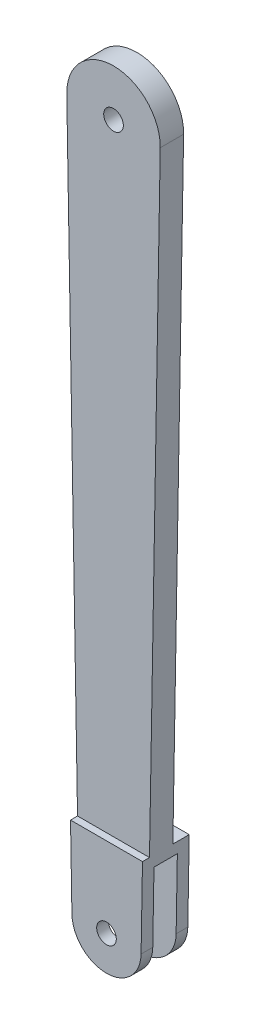
ISO-10303-21;
HEADER;
FILE_DESCRIPTION(('STEP AP214'),'2;1');
FILE_NAME('part.step','',(''),(''),'','','');
FILE_SCHEMA(('AUTOMOTIVE_DESIGN { 1 0 10303 214 1 1 1 1 }'));
ENDSEC;
DATA;
#1=APPLICATION_CONTEXT('core data for automotive mechanical design processes');
#2=APPLICATION_PROTOCOL_DEFINITION('international standard','automotive_design',2000,#1);
#3=PRODUCT_CONTEXT('',#1,'mechanical');
#4=PRODUCT('Part','Part','',(#3));
#5=PRODUCT_RELATED_PRODUCT_CATEGORY('part','',(#4));
#6=PRODUCT_DEFINITION_FORMATION('','',#4);
#7=PRODUCT_DEFINITION_CONTEXT('part definition',#1,'design');
#8=PRODUCT_DEFINITION('design','',#6,#7);
#9=PRODUCT_DEFINITION_SHAPE('','',#8);
#10=(LENGTH_UNIT() NAMED_UNIT(*) SI_UNIT(.MILLI.,.METRE.));
#11=(NAMED_UNIT(*) PLANE_ANGLE_UNIT() SI_UNIT($,.RADIAN.));
#12=(NAMED_UNIT(*) SI_UNIT($,.STERADIAN.) SOLID_ANGLE_UNIT());
#13=UNCERTAINTY_MEASURE_WITH_UNIT(LENGTH_MEASURE(1.E-05),#10,'distance_accuracy_value','');
#14=(GEOMETRIC_REPRESENTATION_CONTEXT(3) GLOBAL_UNCERTAINTY_ASSIGNED_CONTEXT((#13)) GLOBAL_UNIT_ASSIGNED_CONTEXT((#10,
#11,#12)) REPRESENTATION_CONTEXT('',''));
#15=CARTESIAN_POINT('',(0.,0.,0.));
#16=DIRECTION('',(0.,0.,1.));
#17=DIRECTION('',(1.,0.,0.));
#18=AXIS2_PLACEMENT_3D('',#15,#16,#17);
#19=CARTESIAN_POINT('',(8.6986929684867,-0.150799999999997,2.5));
#20=DIRECTION('',(0.999849766492724,-0.017333333333333,0.));
#21=DIRECTION('',(0.017333333333333,0.999849766492725,0.));
#22=AXIS2_PLACEMENT_3D('',#19,#20,#21);
#23=PLANE('',#22);
#24=DIRECTION('',(0.,0.,1.));
#25=VECTOR('',#24,1.);
#26=CARTESIAN_POINT('',(7.39888827204619,-75.1282666666667,-10.));
#27=LINE('',#26,#25);
#28=CARTESIAN_POINT('',(7.39888827204619,-75.1282666666667,-6.));
#29=VERTEX_POINT('',#28);
#30=CARTESIAN_POINT('',(7.39888827204618,-75.1282666666667,-3.5));
#31=VERTEX_POINT('',#30);
#32=EDGE_CURVE('E149',#29,#31,#27,.T.);
#33=ORIENTED_EDGE('',*,*,#32,.F.);
#34=DIRECTION('',(-0.017333333333333,-0.999849766492725,0.));
#35=VECTOR('',#34,1.);
#36=CARTESIAN_POINT('',(8.6986929684867,-0.150799999999997,-6.));
#37=LINE('',#36,#35);
#38=CARTESIAN_POINT('',(7.69841209667576,-57.8506420831153,-6.));
#39=VERTEX_POINT('',#38);
#40=EDGE_CURVE('E58',#39,#29,#37,.T.);
#41=ORIENTED_EDGE('',*,*,#40,.F.);
#42=DIRECTION('',(0.,0.,1.));
#43=VECTOR('',#42,1.);
#44=CARTESIAN_POINT('',(7.69841209667576,-57.8506420831153,-10.));
#45=LINE('',#44,#43);
#46=CARTESIAN_POINT('',(7.69841209667576,-57.8506420831153,-2.5));
#47=VERTEX_POINT('',#46);
#48=EDGE_CURVE('E211',#39,#47,#45,.T.);
#49=ORIENTED_EDGE('',*,*,#48,.T.);
#50=DIRECTION('',(-0.017333333333333,-0.999849766492725,0.));
#51=VECTOR('',#50,1.);
#52=CARTESIAN_POINT('',(8.6986929684867,-0.150799999999997,-2.5));
#53=LINE('',#52,#51);
#54=CARTESIAN_POINT('',(9.99849766492722,74.8266666666667,-2.5));
#55=VERTEX_POINT('',#54);
#56=EDGE_CURVE('E170',#55,#47,#53,.T.);
#57=ORIENTED_EDGE('',*,*,#56,.F.);
#58=DIRECTION('',(0.,0.,-1.));
#59=VECTOR('',#58,1.);
#60=CARTESIAN_POINT('',(9.99849766492722,74.8266666666667,2.5));
#61=LINE('',#60,#59);
#62=CARTESIAN_POINT('',(9.99849766492722,74.8266666666667,2.5));
#63=VERTEX_POINT('',#62);
#64=EDGE_CURVE('E178',#63,#55,#61,.T.);
#65=ORIENTED_EDGE('',*,*,#64,.F.);
#66=DIRECTION('',(-0.017333333333333,-0.999849766492725,0.));
#67=VECTOR('',#66,1.);
#68=CARTESIAN_POINT('',(8.6986929684867,-0.150799999999997,2.5));
#69=LINE('',#68,#67);
#70=CARTESIAN_POINT('',(7.69841209667576,-57.8506420831153,2.5));
#71=VERTEX_POINT('',#70);
#72=EDGE_CURVE('E157',#63,#71,#69,.T.);
#73=ORIENTED_EDGE('',*,*,#72,.T.);
#74=CARTESIAN_POINT('',(7.69841209667576,-57.8506420831153,4.));
#75=VERTEX_POINT('',#74);
#76=EDGE_CURVE('E212',#71,#75,#45,.T.);
#77=ORIENTED_EDGE('',*,*,#76,.T.);
#78=DIRECTION('',(-0.017333333333333,-0.999849766492725,0.));
#79=VECTOR('',#78,1.);
#80=CARTESIAN_POINT('',(8.6986929684867,-0.150799999999997,4.));
#81=LINE('',#80,#79);
#82=CARTESIAN_POINT('',(7.39888827204619,-75.1282666666667,4.));
#83=VERTEX_POINT('',#82);
#84=EDGE_CURVE('E205',#75,#83,#81,.T.);
#85=ORIENTED_EDGE('',*,*,#84,.T.);
#86=CARTESIAN_POINT('',(7.39888827204618,-75.1282666666667,1.50000000000001));
#87=VERTEX_POINT('',#86);
#88=EDGE_CURVE('E146',#87,#83,#27,.T.);
#89=ORIENTED_EDGE('',*,*,#88,.F.);
#90=DIRECTION('',(-0.017333333333333,-0.999849766492725,0.));
#91=VECTOR('',#90,1.);
#92=CARTESIAN_POINT('',(8.6986929684867,-0.150799999999997,1.49999999999997));
#93=LINE('',#92,#91);
#94=CARTESIAN_POINT('',(7.6585339990367,-60.1509559261494,1.5));
#95=VERTEX_POINT('',#94);
#96=EDGE_CURVE('E190',#95,#87,#93,.T.);
#97=ORIENTED_EDGE('',*,*,#96,.F.);
#98=DIRECTION('',(0.,0.,1.));
#99=VECTOR('',#98,1.);
#100=CARTESIAN_POINT('',(7.6585339990367,-60.1509559261494,2.5));
#101=LINE('',#100,#99);
#102=CARTESIAN_POINT('',(7.6585339990367,-60.1509559261494,-3.5));
#103=VERTEX_POINT('',#102);
#104=EDGE_CURVE('E189',#103,#95,#101,.T.);
#105=ORIENTED_EDGE('',*,*,#104,.F.);
#106=DIRECTION('',(0.017333333333333,0.999849766492725,0.));
#107=VECTOR('',#106,1.);
#108=CARTESIAN_POINT('',(8.6986929684867,-0.150799999999998,-3.50000000000001));
#109=LINE('',#108,#107);
#110=EDGE_CURVE('E183',#31,#103,#109,.T.);
#111=ORIENTED_EDGE('',*,*,#110,.F.);
#112=EDGE_LOOP('',(#33,#41,#49,#57,#65,#73,#77,#85,#89,#97,#105,#111));
#113=FACE_BOUND('',#112,.T.);
#114=ADVANCED_FACE('F43',(#113),#23,.T.);
#115=CARTESIAN_POINT('',(-8.69869296848671,-0.150800000000002,2.5));
#116=DIRECTION('',(0.999849766492724,0.0173333333333336,0.));
#117=DIRECTION('',(-0.0173333333333336,0.999849766492725,0.));
#118=AXIS2_PLACEMENT_3D('',#115,#116,#117);
#119=PLANE('',#118);
#120=DIRECTION('',(-0.0173333333333336,0.999849766492725,0.));
#121=VECTOR('',#120,1.);
#122=CARTESIAN_POINT('',(-8.69869296848671,-0.150800000000002,-6.));
#123=LINE('',#122,#121);
#124=CARTESIAN_POINT('',(-7.39888827204615,-75.1282666666667,-6.));
#125=VERTEX_POINT('',#124);
#126=CARTESIAN_POINT('',(-7.69841209667573,-57.8506420831153,-6.));
#127=VERTEX_POINT('',#126);
#128=EDGE_CURVE('E132',#125,#127,#123,.T.);
#129=ORIENTED_EDGE('',*,*,#128,.F.);
#130=DIRECTION('',(0.,0.,1.));
#131=VECTOR('',#130,1.);
#132=CARTESIAN_POINT('',(-7.39888827204615,-75.1282666666667,-10.));
#133=LINE('',#132,#131);
#134=CARTESIAN_POINT('',(-7.39888827204615,-75.1282666666667,-3.5));
#135=VERTEX_POINT('',#134);
#136=EDGE_CURVE('E66',#125,#135,#133,.T.);
#137=ORIENTED_EDGE('',*,*,#136,.T.);
#138=DIRECTION('',(0.0173333333333336,-0.999849766492725,0.));
#139=VECTOR('',#138,1.);
#140=CARTESIAN_POINT('',(-7.65393207105147,-60.4164118850773,-3.5));
#141=LINE('',#140,#139);
#142=CARTESIAN_POINT('',(-7.65393207105147,-60.4164118850773,-3.5));
#143=VERTEX_POINT('',#142);
#144=EDGE_CURVE('E185',#143,#135,#141,.T.);
#145=ORIENTED_EDGE('',*,*,#144,.F.);
#146=DIRECTION('',(0.,0.,-1.));
#147=VECTOR('',#146,1.);
#148=CARTESIAN_POINT('',(-7.65393207105147,-60.4164118850773,1.5));
#149=LINE('',#148,#147);
#150=CARTESIAN_POINT('',(-7.65393207105147,-60.4164118850773,1.5));
#151=VERTEX_POINT('',#150);
#152=EDGE_CURVE('E240',#151,#143,#149,.T.);
#153=ORIENTED_EDGE('',*,*,#152,.F.);
#154=DIRECTION('',(-0.0173333333333336,0.999849766492725,0.));
#155=VECTOR('',#154,1.);
#156=CARTESIAN_POINT('',(-7.65393207105147,-60.4164118850773,1.5));
#157=LINE('',#156,#155);
#158=CARTESIAN_POINT('',(-7.39888827204615,-75.1282666666667,1.50000000000001));
#159=VERTEX_POINT('',#158);
#160=EDGE_CURVE('E231',#159,#151,#157,.T.);
#161=ORIENTED_EDGE('',*,*,#160,.F.);
#162=CARTESIAN_POINT('',(-7.39888827204615,-75.1282666666667,4.));
#163=VERTEX_POINT('',#162);
#164=EDGE_CURVE('E147',#159,#163,#133,.T.);
#165=ORIENTED_EDGE('',*,*,#164,.T.);
#166=DIRECTION('',(0.0173333333333336,-0.999849766492725,0.));
#167=VECTOR('',#166,1.);
#168=CARTESIAN_POINT('',(-8.69869296848671,-0.150800000000002,4.));
#169=LINE('',#168,#167);
#170=CARTESIAN_POINT('',(-7.69841209667573,-57.8506420831153,4.));
#171=VERTEX_POINT('',#170);
#172=EDGE_CURVE('E199',#171,#163,#169,.T.);
#173=ORIENTED_EDGE('',*,*,#172,.F.);
#174=DIRECTION('',(0.,0.,1.));
#175=VECTOR('',#174,1.);
#176=CARTESIAN_POINT('',(-7.69841209667573,-57.8506420831153,-10.));
#177=LINE('',#176,#175);
#178=CARTESIAN_POINT('',(-7.69841209667573,-57.8506420831153,2.5));
#179=VERTEX_POINT('',#178);
#180=EDGE_CURVE('E210',#179,#171,#177,.T.);
#181=ORIENTED_EDGE('',*,*,#180,.F.);
#182=DIRECTION('',(0.0173333333333336,-0.999849766492725,0.));
#183=VECTOR('',#182,1.);
#184=CARTESIAN_POINT('',(-8.69869296848671,-0.150800000000002,2.5));
#185=LINE('',#184,#183);
#186=CARTESIAN_POINT('',(-9.99849766492727,74.8266666666667,2.5));
#187=VERTEX_POINT('',#186);
#188=EDGE_CURVE('E163',#187,#179,#185,.T.);
#189=ORIENTED_EDGE('',*,*,#188,.F.);
#190=DIRECTION('',(0.,0.,-1.));
#191=VECTOR('',#190,1.);
#192=CARTESIAN_POINT('',(-9.99849766492727,74.8266666666667,2.5));
#193=LINE('',#192,#191);
#194=CARTESIAN_POINT('',(-9.99849766492727,74.8266666666667,-2.5));
#195=VERTEX_POINT('',#194);
#196=EDGE_CURVE('E166',#187,#195,#193,.T.);
#197=ORIENTED_EDGE('',*,*,#196,.T.);
#198=DIRECTION('',(0.0173333333333336,-0.999849766492725,0.));
#199=VECTOR('',#198,1.);
#200=CARTESIAN_POINT('',(-8.69869296848671,-0.150800000000002,-2.5));
#201=LINE('',#200,#199);
#202=CARTESIAN_POINT('',(-7.69841209667573,-57.8506420831153,-2.5));
#203=VERTEX_POINT('',#202);
#204=EDGE_CURVE('E158',#195,#203,#201,.T.);
#205=ORIENTED_EDGE('',*,*,#204,.T.);
#206=EDGE_CURVE('E140',#127,#203,#177,.T.);
#207=ORIENTED_EDGE('',*,*,#206,.F.);
#208=EDGE_LOOP('',(#129,#137,#145,#153,#161,#165,#173,#181,#189,#197,#205,#207));
#209=FACE_BOUND('',#208,.T.);
#210=ADVANCED_FACE('F138',(#209),#119,.F.);
#211=CARTESIAN_POINT('',(0.,-57.8506420831153,-10.));
#212=DIRECTION('',(0.,-1.,0.));
#213=DIRECTION('',(1.,0.,0.));
#214=AXIS2_PLACEMENT_3D('',#211,#212,#213);
#215=PLANE('',#214);
#216=DIRECTION('',(1.,0.,0.));
#217=VECTOR('',#216,1.);
#218=CARTESIAN_POINT('',(0.,-57.8506420831153,-6.));
#219=LINE('',#218,#217);
#220=EDGE_CURVE('E141',#127,#39,#219,.T.);
#221=ORIENTED_EDGE('',*,*,#220,.F.);
#222=ORIENTED_EDGE('',*,*,#206,.T.);
#223=DIRECTION('',(1.,0.,0.));
#224=VECTOR('',#223,1.);
#225=CARTESIAN_POINT('',(0.,-57.8506420831153,-2.5));
#226=LINE('',#225,#224);
#227=EDGE_CURVE('E167',#203,#47,#226,.T.);
#228=ORIENTED_EDGE('',*,*,#227,.T.);
#229=ORIENTED_EDGE('',*,*,#48,.F.);
#230=EDGE_LOOP('',(#221,#222,#228,#229));
#231=FACE_BOUND('',#230,.T.);
#232=ADVANCED_FACE('F277',(#231),#215,.F.);
#233=CARTESIAN_POINT('',(0.,-75.,-10.));
#234=DIRECTION('',(0.,0.,1.));
#235=DIRECTION('',(1.,0.,0.));
#236=AXIS2_PLACEMENT_3D('',#233,#234,#235);
#237=CYLINDRICAL_SURFACE('',#236,7.4);
#238=ORIENTED_EDGE('',*,*,#136,.F.);
#239=CARTESIAN_POINT('',(0.,-75.,-6.));
#240=DIRECTION('',(0.,0.,-1.));
#241=DIRECTION('',(-1.,0.,0.));
#242=AXIS2_PLACEMENT_3D('',#239,#240,#241);
#243=CIRCLE('',#242,7.4);
#244=EDGE_CURVE('E130',#29,#125,#243,.T.);
#245=ORIENTED_EDGE('',*,*,#244,.F.);
#246=ORIENTED_EDGE('',*,*,#32,.T.);
#247=CARTESIAN_POINT('',(0.,-75.,-3.5));
#248=DIRECTION('',(0.,0.,-1.));
#249=DIRECTION('',(0.,1.,0.));
#250=AXIS2_PLACEMENT_3D('',#247,#248,#249);
#251=CIRCLE('',#250,7.4);
#252=EDGE_CURVE('E51',#135,#31,#251,.F.);
#253=ORIENTED_EDGE('',*,*,#252,.F.);
#254=EDGE_LOOP('',(#238,#245,#246,#253));
#255=FACE_BOUND('',#254,.T.);
#256=ADVANCED_FACE('F144',(#255),#237,.T.);
#257=CARTESIAN_POINT('',(0.,-75.,1.50000000000001));
#258=DIRECTION('',(0.,0.,1.));
#259=DIRECTION('',(0.,-1.,0.));
#260=AXIS2_PLACEMENT_3D('',#257,#258,#259);
#261=CIRCLE('',#260,7.4);
#262=EDGE_CURVE('E11',#87,#159,#261,.F.);
#263=ORIENTED_EDGE('',*,*,#262,.F.);
#264=ORIENTED_EDGE('',*,*,#88,.T.);
#265=CARTESIAN_POINT('',(0.,-75.,4.));
#266=DIRECTION('',(0.,0.,1.));
#267=DIRECTION('',(1.,0.,0.));
#268=AXIS2_PLACEMENT_3D('',#265,#266,#267);
#269=CIRCLE('',#268,7.4);
#270=EDGE_CURVE('E202',#163,#83,#269,.T.);
#271=ORIENTED_EDGE('',*,*,#270,.F.);
#272=ORIENTED_EDGE('',*,*,#164,.F.);
#273=EDGE_LOOP('',(#263,#264,#271,#272));
#274=FACE_BOUND('',#273,.T.);
#275=ADVANCED_FACE('F234',(#274),#237,.T.);
#276=CARTESIAN_POINT('',(0.,75.,2.5));
#277=DIRECTION('',(0.,0.,-1.));
#278=DIRECTION('',(-1.,0.,0.));
#279=AXIS2_PLACEMENT_3D('',#276,#277,#278);
#280=CYLINDRICAL_SURFACE('',#279,10.);
#281=CARTESIAN_POINT('',(0.,75.,-2.5));
#282=DIRECTION('',(0.,0.,1.));
#283=DIRECTION('',(1.,0.,0.));
#284=AXIS2_PLACEMENT_3D('',#281,#282,#283);
#285=CIRCLE('',#284,10.);
#286=EDGE_CURVE('E173',#55,#195,#285,.T.);
#287=ORIENTED_EDGE('',*,*,#286,.T.);
#288=ORIENTED_EDGE('',*,*,#196,.F.);
#289=CARTESIAN_POINT('',(0.,75.,2.5));
#290=DIRECTION('',(0.,0.,1.));
#291=DIRECTION('',(1.,0.,0.));
#292=AXIS2_PLACEMENT_3D('',#289,#290,#291);
#293=CIRCLE('',#292,10.);
#294=EDGE_CURVE('E161',#63,#187,#293,.T.);
#295=ORIENTED_EDGE('',*,*,#294,.F.);
#296=ORIENTED_EDGE('',*,*,#64,.T.);
#297=EDGE_LOOP('',(#287,#288,#295,#296));
#298=FACE_BOUND('',#297,.T.);
#299=ADVANCED_FACE('F290',(#298),#280,.T.);
#300=CARTESIAN_POINT('',(0.,0.,2.5));
#301=DIRECTION('',(0.,0.,1.));
#302=DIRECTION('',(1.,0.,0.));
#303=AXIS2_PLACEMENT_3D('',#300,#301,#302);
#304=PLANE('',#303);
#305=CARTESIAN_POINT('',(0.,75.,2.5));
#306=DIRECTION('',(0.,0.,1.));
#307=DIRECTION('',(1.,0.,0.));
#308=AXIS2_PLACEMENT_3D('',#305,#306,#307);
#309=CIRCLE('',#308,2.1);
#310=CARTESIAN_POINT('',(2.09999999999997,75.,2.5));
#311=VERTEX_POINT('',#310);
#312=EDGE_CURVE('E247',#311,#311,#309,.T.);
#313=ORIENTED_EDGE('',*,*,#312,.F.);
#314=EDGE_LOOP('',(#313));
#315=FACE_BOUND('',#314,.T.);
#316=DIRECTION('',(1.,0.,0.));
#317=VECTOR('',#316,1.);
#318=CARTESIAN_POINT('',(0.,-57.8506420831153,2.5));
#319=LINE('',#318,#317);
#320=EDGE_CURVE('E154',#179,#71,#319,.T.);
#321=ORIENTED_EDGE('',*,*,#320,.T.);
#322=ORIENTED_EDGE('',*,*,#72,.F.);
#323=ORIENTED_EDGE('',*,*,#294,.T.);
#324=ORIENTED_EDGE('',*,*,#188,.T.);
#325=EDGE_LOOP('',(#321,#322,#323,#324));
#326=FACE_BOUND('',#325,.T.);
#327=ADVANCED_FACE('F292',(#315,#326),#304,.T.);
#328=CARTESIAN_POINT('',(0.,0.,-2.5));
#329=DIRECTION('',(0.,0.,1.));
#330=DIRECTION('',(1.,0.,0.));
#331=AXIS2_PLACEMENT_3D('',#328,#329,#330);
#332=PLANE('',#331);
#333=CARTESIAN_POINT('',(0.,75.,-2.5));
#334=DIRECTION('',(0.,0.,1.));
#335=DIRECTION('',(1.,0.,0.));
#336=AXIS2_PLACEMENT_3D('',#333,#334,#335);
#337=CIRCLE('',#336,2.1);
#338=CARTESIAN_POINT('',(2.09999999999997,75.,-2.5));
#339=VERTEX_POINT('',#338);
#340=EDGE_CURVE('E46',#339,#339,#337,.T.);
#341=ORIENTED_EDGE('',*,*,#340,.T.);
#342=EDGE_LOOP('',(#341));
#343=FACE_BOUND('',#342,.T.);
#344=ORIENTED_EDGE('',*,*,#227,.F.);
#345=ORIENTED_EDGE('',*,*,#204,.F.);
#346=ORIENTED_EDGE('',*,*,#286,.F.);
#347=ORIENTED_EDGE('',*,*,#56,.T.);
#348=EDGE_LOOP('',(#344,#345,#346,#347));
#349=FACE_BOUND('',#348,.T.);
#350=ADVANCED_FACE('F275',(#343,#349),#332,.F.);
#351=ORIENTED_EDGE('',*,*,#320,.F.);
#352=ORIENTED_EDGE('',*,*,#180,.T.);
#353=DIRECTION('',(1.,0.,0.));
#354=VECTOR('',#353,1.);
#355=CARTESIAN_POINT('',(0.,-57.8506420831153,4.));
#356=LINE('',#355,#354);
#357=EDGE_CURVE('E151',#171,#75,#356,.T.);
#358=ORIENTED_EDGE('',*,*,#357,.T.);
#359=ORIENTED_EDGE('',*,*,#76,.F.);
#360=EDGE_LOOP('',(#351,#352,#358,#359));
#361=FACE_BOUND('',#360,.T.);
#362=ADVANCED_FACE('F223',(#361),#215,.F.);
#363=CARTESIAN_POINT('',(0.,0.,4.));
#364=DIRECTION('',(0.,0.,1.));
#365=DIRECTION('',(1.,0.,0.));
#366=AXIS2_PLACEMENT_3D('',#363,#364,#365);
#367=PLANE('',#366);
#368=CARTESIAN_POINT('',(0.,-75.,4.));
#369=DIRECTION('',(0.,0.,1.));
#370=DIRECTION('',(1.,0.,0.));
#371=AXIS2_PLACEMENT_3D('',#368,#369,#370);
#372=CIRCLE('',#371,2.1);
#373=CARTESIAN_POINT('',(2.10000000000002,-75.,4.));
#374=VERTEX_POINT('',#373);
#375=EDGE_CURVE('E256',#374,#374,#372,.T.);
#376=ORIENTED_EDGE('',*,*,#375,.F.);
#377=EDGE_LOOP('',(#376));
#378=FACE_BOUND('',#377,.T.);
#379=ORIENTED_EDGE('',*,*,#172,.T.);
#380=ORIENTED_EDGE('',*,*,#270,.T.);
#381=ORIENTED_EDGE('',*,*,#84,.F.);
#382=ORIENTED_EDGE('',*,*,#357,.F.);
#383=EDGE_LOOP('',(#379,#380,#381,#382));
#384=FACE_BOUND('',#383,.T.);
#385=ADVANCED_FACE('F221',(#378,#384),#367,.T.);
#386=CARTESIAN_POINT('',(12.343063258803,-60.0697452184107,1.5));
#387=DIRECTION('',(0.,0.,1.));
#388=DIRECTION('',(0.,-1.,0.));
#389=AXIS2_PLACEMENT_3D('',#386,#387,#388);
#390=PLANE('',#389);
#391=CARTESIAN_POINT('',(0.,-75.,1.50000000000001));
#392=DIRECTION('',(0.,0.,1.));
#393=DIRECTION('',(0.,-1.,0.));
#394=AXIS2_PLACEMENT_3D('',#391,#392,#393);
#395=CIRCLE('',#394,2.1);
#396=CARTESIAN_POINT('',(0.,-77.1,1.50000000000001));
#397=VERTEX_POINT('',#396);
#398=EDGE_CURVE('E250',#397,#397,#395,.T.);
#399=ORIENTED_EDGE('',*,*,#398,.T.);
#400=EDGE_LOOP('',(#399));
#401=FACE_BOUND('',#400,.T.);
#402=ORIENTED_EDGE('',*,*,#96,.T.);
#403=ORIENTED_EDGE('',*,*,#262,.T.);
#404=ORIENTED_EDGE('',*,*,#160,.T.);
#405=DIRECTION('',(-0.999849766492724,-0.0173333333333336,0.));
#406=VECTOR('',#405,1.);
#407=CARTESIAN_POINT('',(12.343063258803,-60.0697452184107,1.5));
#408=LINE('',#407,#406);
#409=EDGE_CURVE('E194',#95,#151,#408,.T.);
#410=ORIENTED_EDGE('',*,*,#409,.F.);
#411=EDGE_LOOP('',(#402,#403,#404,#410));
#412=FACE_BOUND('',#411,.T.);
#413=ADVANCED_FACE('F237',(#401,#412),#390,.F.);
#414=CARTESIAN_POINT('',(12.343063258803,-60.0697452184107,-3.5));
#415=DIRECTION('',(0.,0.,-1.));
#416=DIRECTION('',(0.,1.,0.));
#417=AXIS2_PLACEMENT_3D('',#414,#415,#416);
#418=PLANE('',#417);
#419=CARTESIAN_POINT('',(0.,-75.,-3.5));
#420=DIRECTION('',(0.,0.,-1.));
#421=DIRECTION('',(0.,1.,0.));
#422=AXIS2_PLACEMENT_3D('',#419,#420,#421);
#423=CIRCLE('',#422,2.1);
#424=CARTESIAN_POINT('',(0.,-72.9,-3.5));
#425=VERTEX_POINT('',#424);
#426=EDGE_CURVE('E253',#425,#425,#423,.T.);
#427=ORIENTED_EDGE('',*,*,#426,.T.);
#428=EDGE_LOOP('',(#427));
#429=FACE_BOUND('',#428,.T.);
#430=ORIENTED_EDGE('',*,*,#110,.T.);
#431=DIRECTION('',(-0.999849766492724,-0.0173333333333336,0.));
#432=VECTOR('',#431,1.);
#433=CARTESIAN_POINT('',(12.343063258803,-60.0697452184107,-3.5));
#434=LINE('',#433,#432);
#435=EDGE_CURVE('E191',#103,#143,#434,.T.);
#436=ORIENTED_EDGE('',*,*,#435,.T.);
#437=ORIENTED_EDGE('',*,*,#144,.T.);
#438=ORIENTED_EDGE('',*,*,#252,.T.);
#439=EDGE_LOOP('',(#430,#436,#437,#438));
#440=FACE_BOUND('',#439,.T.);
#441=ADVANCED_FACE('F182',(#429,#440),#418,.F.);
#442=CARTESIAN_POINT('',(12.343063258803,-60.0697452184107,1.5));
#443=DIRECTION('',(-0.0173333333333336,0.999849766492724,0.));
#444=DIRECTION('',(-0.999849766492725,-0.0173333333333336,0.));
#445=AXIS2_PLACEMENT_3D('',#442,#443,#444);
#446=PLANE('',#445);
#447=ORIENTED_EDGE('',*,*,#104,.T.);
#448=ORIENTED_EDGE('',*,*,#409,.T.);
#449=ORIENTED_EDGE('',*,*,#152,.T.);
#450=ORIENTED_EDGE('',*,*,#435,.F.);
#451=EDGE_LOOP('',(#447,#448,#449,#450));
#452=FACE_BOUND('',#451,.T.);
#453=ADVANCED_FACE('F325',(#452),#446,.F.);
#454=CARTESIAN_POINT('',(0.,0.,-6.));
#455=DIRECTION('',(0.,0.,-1.));
#456=DIRECTION('',(-1.,0.,0.));
#457=AXIS2_PLACEMENT_3D('',#454,#455,#456);
#458=PLANE('',#457);
#459=CARTESIAN_POINT('',(0.,-75.,-6.));
#460=DIRECTION('',(0.,0.,1.));
#461=DIRECTION('',(1.,0.,0.));
#462=AXIS2_PLACEMENT_3D('',#459,#460,#461);
#463=CIRCLE('',#462,2.1);
#464=CARTESIAN_POINT('',(2.10000000000002,-75.,-6.));
#465=VERTEX_POINT('',#464);
#466=EDGE_CURVE('E257',#465,#465,#463,.T.);
#467=ORIENTED_EDGE('',*,*,#466,.T.);
#468=EDGE_LOOP('',(#467));
#469=FACE_BOUND('',#468,.T.);
#470=ORIENTED_EDGE('',*,*,#40,.T.);
#471=ORIENTED_EDGE('',*,*,#244,.T.);
#472=ORIENTED_EDGE('',*,*,#128,.T.);
#473=ORIENTED_EDGE('',*,*,#220,.T.);
#474=EDGE_LOOP('',(#470,#471,#472,#473));
#475=FACE_BOUND('',#474,.T.);
#476=ADVANCED_FACE('F131',(#469,#475),#458,.T.);
#477=CARTESIAN_POINT('',(0.,-75.,-6.));
#478=DIRECTION('',(0.,0.,1.));
#479=DIRECTION('',(1.,0.,0.));
#480=AXIS2_PLACEMENT_3D('',#477,#478,#479);
#481=CYLINDRICAL_SURFACE('',#480,2.1);
#482=ORIENTED_EDGE('',*,*,#466,.F.);
#483=EDGE_LOOP('',(#482));
#484=FACE_BOUND('',#483,.T.);
#485=ORIENTED_EDGE('',*,*,#426,.F.);
#486=EDGE_LOOP('',(#485));
#487=FACE_BOUND('',#486,.T.);
#488=ADVANCED_FACE('F320',(#484,#487),#481,.F.);
#489=ORIENTED_EDGE('',*,*,#375,.T.);
#490=EDGE_LOOP('',(#489));
#491=FACE_BOUND('',#490,.T.);
#492=ORIENTED_EDGE('',*,*,#398,.F.);
#493=EDGE_LOOP('',(#492));
#494=FACE_BOUND('',#493,.T.);
#495=ADVANCED_FACE('F263',(#491,#494),#481,.F.);
#496=CARTESIAN_POINT('',(0.,75.,-6.));
#497=DIRECTION('',(0.,0.,1.));
#498=DIRECTION('',(1.,0.,0.));
#499=AXIS2_PLACEMENT_3D('',#496,#497,#498);
#500=CYLINDRICAL_SURFACE('',#499,2.1);
#501=ORIENTED_EDGE('',*,*,#312,.T.);
#502=EDGE_LOOP('',(#501));
#503=FACE_BOUND('',#502,.T.);
#504=ORIENTED_EDGE('',*,*,#340,.F.);
#505=EDGE_LOOP('',(#504));
#506=FACE_BOUND('',#505,.T.);
#507=ADVANCED_FACE('F313',(#503,#506),#500,.F.);
#508=CLOSED_SHELL('',(#114,#210,#232,#256,#275,#299,#327,#350,#362,#385,#413,#441,#453,#476,
#488,#495,#507));
#509=MANIFOLD_SOLID_BREP('B2',#508);
#510=ADVANCED_BREP_SHAPE_REPRESENTATION('',(#18,#509),#14);
#511=SHAPE_DEFINITION_REPRESENTATION(#9,#510);
ENDSEC;
END-ISO-10303-21;
